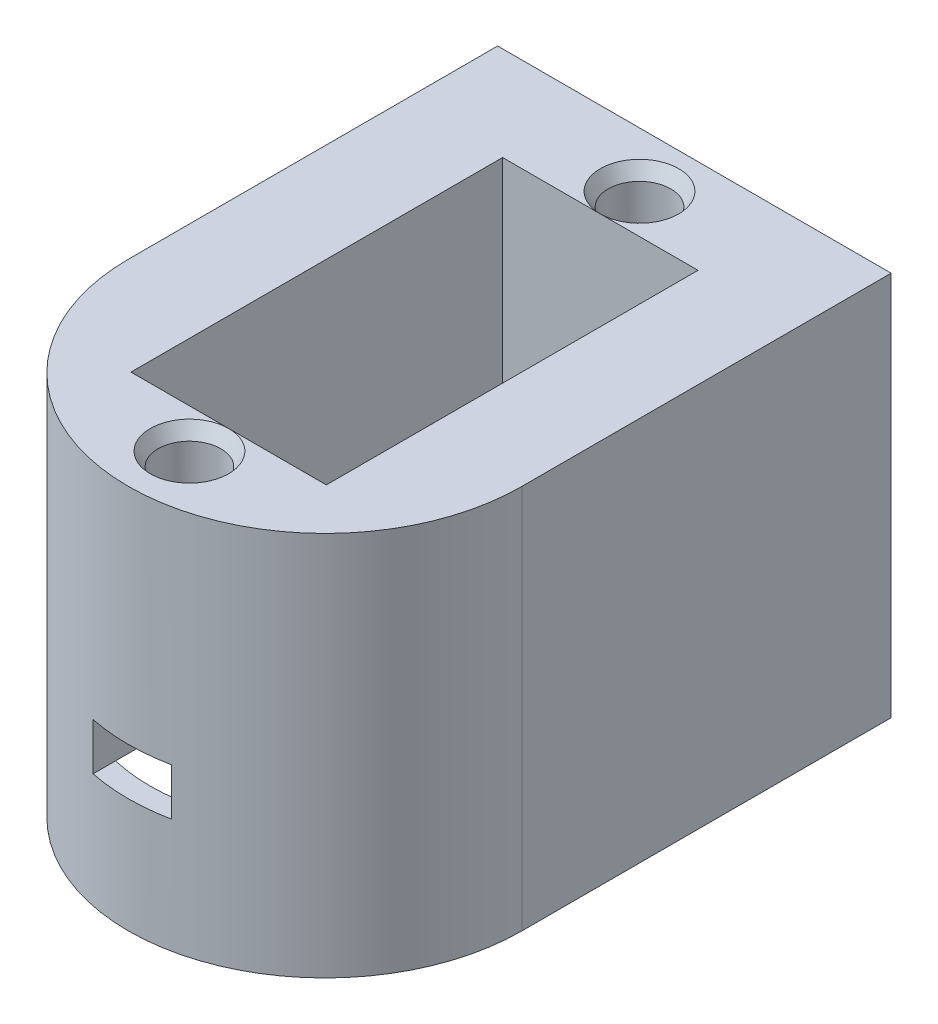
ISO-10303-21;
HEADER;
FILE_DESCRIPTION(('STEP AP214'),'2;1');
FILE_NAME('part.step','',(''),(''),'','','');
FILE_SCHEMA(('AUTOMOTIVE_DESIGN { 1 0 10303 214 1 1 1 1 }'));
ENDSEC;
DATA;
#1=APPLICATION_CONTEXT('core data for automotive mechanical design processes');
#2=APPLICATION_PROTOCOL_DEFINITION('international standard','automotive_design',2000,#1);
#3=PRODUCT_CONTEXT('',#1,'mechanical');
#4=PRODUCT('Part','Part','',(#3));
#5=PRODUCT_RELATED_PRODUCT_CATEGORY('part','',(#4));
#6=PRODUCT_DEFINITION_FORMATION('','',#4);
#7=PRODUCT_DEFINITION_CONTEXT('part definition',#1,'design');
#8=PRODUCT_DEFINITION('design','',#6,#7);
#9=PRODUCT_DEFINITION_SHAPE('','',#8);
#10=(LENGTH_UNIT() NAMED_UNIT(*) SI_UNIT(.MILLI.,.METRE.));
#11=(NAMED_UNIT(*) PLANE_ANGLE_UNIT() SI_UNIT($,.RADIAN.));
#12=(NAMED_UNIT(*) SI_UNIT($,.STERADIAN.) SOLID_ANGLE_UNIT());
#13=UNCERTAINTY_MEASURE_WITH_UNIT(LENGTH_MEASURE(1.E-05),#10,'distance_accuracy_value','');
#14=(GEOMETRIC_REPRESENTATION_CONTEXT(3) GLOBAL_UNCERTAINTY_ASSIGNED_CONTEXT((#13)) GLOBAL_UNIT_ASSIGNED_CONTEXT((#10,
#11,#12)) REPRESENTATION_CONTEXT('',''));
#15=CARTESIAN_POINT('',(0.,0.,0.));
#16=DIRECTION('',(0.,0.,1.));
#17=DIRECTION('',(1.,0.,0.));
#18=AXIS2_PLACEMENT_3D('',#15,#16,#17);
#19=CARTESIAN_POINT('',(-6.23,55.2500254806121,6.));
#20=DIRECTION('',(0.,1.,0.));
#21=DIRECTION('',(0.,0.,1.));
#22=AXIS2_PLACEMENT_3D('',#19,#20,#21);
#23=PLANE('',#22);
#24=DIRECTION('',(0.,0.,1.));
#25=VECTOR('',#24,1.);
#26=CARTESIAN_POINT('',(2.5,55.2500254806121,-0.001000000000001));
#27=LINE('',#26,#25);
#28=CARTESIAN_POINT('',(2.5,55.2500254806121,29.7));
#29=VERTEX_POINT('',#28);
#30=CARTESIAN_POINT('',(2.5,55.2500254806121,34.4161170617659));
#31=VERTEX_POINT('',#30);
#32=EDGE_CURVE('E319',#29,#31,#27,.T.);
#33=ORIENTED_EDGE('',*,*,#32,.F.);
#34=DIRECTION('',(1.,0.,0.));
#35=VECTOR('',#34,1.);
#36=CARTESIAN_POINT('',(-6.23,55.2500254806121,29.7));
#37=LINE('',#36,#35);
#38=CARTESIAN_POINT('',(6.23,55.2500254806121,29.7));
#39=VERTEX_POINT('',#38);
#40=EDGE_CURVE('E193',#29,#39,#37,.T.);
#41=ORIENTED_EDGE('',*,*,#40,.T.);
#42=DIRECTION('',(0.,0.,-1.));
#43=VECTOR('',#42,1.);
#44=CARTESIAN_POINT('',(6.23,55.2500254806121,29.7));
#45=LINE('',#44,#43);
#46=CARTESIAN_POINT('',(6.23,55.2500254806121,14.3028599015696));
#47=VERTEX_POINT('',#46);
#48=EDGE_CURVE('E194',#39,#47,#45,.T.);
#49=ORIENTED_EDGE('',*,*,#48,.T.);
#50=CARTESIAN_POINT('',(0.,55.2500254806121,23.55));
#51=DIRECTION('',(0.,1.,0.));
#52=DIRECTION('',(0.,0.,1.));
#53=AXIS2_PLACEMENT_3D('',#50,#51,#52);
#54=CIRCLE('',#53,11.15);
#55=EDGE_CURVE('E172',#31,#47,#54,.T.);
#56=ORIENTED_EDGE('',*,*,#55,.F.);
#57=EDGE_LOOP('',(#33,#41,#49,#56));
#58=FACE_BOUND('',#57,.T.);
#59=ADVANCED_FACE('F41',(#58),#23,.F.);
#60=CARTESIAN_POINT('',(-6.23,11.2879454134343,29.7));
#61=DIRECTION('',(0.,0.,-1.));
#62=DIRECTION('',(-1.,0.,0.));
#63=AXIS2_PLACEMENT_3D('',#60,#61,#62);
#64=PLANE('',#63);
#65=DIRECTION('',(-1.,0.,0.));
#66=VECTOR('',#65,1.);
#67=CARTESIAN_POINT('',(-2.5,58.2500254806121,29.7));
#68=LINE('',#67,#66);
#69=CARTESIAN_POINT('',(2.5,58.2500254806121,29.7));
#70=VERTEX_POINT('',#69);
#71=CARTESIAN_POINT('',(-2.5,58.2500254806121,29.7));
#72=VERTEX_POINT('',#71);
#73=EDGE_CURVE('E304',#70,#72,#68,.T.);
#74=ORIENTED_EDGE('',*,*,#73,.T.);
#75=DIRECTION('',(0.,-1.,0.));
#76=VECTOR('',#75,1.);
#77=CARTESIAN_POINT('',(-2.5,58.2500254806121,29.7));
#78=LINE('',#77,#76);
#79=CARTESIAN_POINT('',(-2.5,55.2500254806121,29.7));
#80=VERTEX_POINT('',#79);
#81=EDGE_CURVE('E303',#72,#80,#78,.T.);
#82=ORIENTED_EDGE('',*,*,#81,.T.);
#83=CARTESIAN_POINT('',(-6.23,55.2500254806121,29.7));
#84=VERTEX_POINT('',#83);
#85=EDGE_CURVE('E218',#84,#80,#37,.T.);
#86=ORIENTED_EDGE('',*,*,#85,.F.);
#87=DIRECTION('',(0.,1.,0.));
#88=VECTOR('',#87,1.);
#89=CARTESIAN_POINT('',(-6.23,11.2879454134343,29.7));
#90=LINE('',#89,#88);
#91=CARTESIAN_POINT('',(-6.23,72.5000254806121,29.7));
#92=VERTEX_POINT('',#91);
#93=EDGE_CURVE('E213',#84,#92,#90,.T.);
#94=ORIENTED_EDGE('',*,*,#93,.T.);
#95=DIRECTION('',(-1.,0.,0.));
#96=VECTOR('',#95,1.);
#97=CARTESIAN_POINT('',(-6.23,72.5000254806121,29.7));
#98=LINE('',#97,#96);
#99=CARTESIAN_POINT('',(0.,72.5000254806121,29.7));
#100=VERTEX_POINT('',#99);
#101=EDGE_CURVE('E200',#100,#92,#98,.T.);
#102=ORIENTED_EDGE('',*,*,#101,.F.);
#103=CARTESIAN_POINT('',(6.23,72.5000254806121,29.7));
#104=VERTEX_POINT('',#103);
#105=EDGE_CURVE('E199',#104,#100,#98,.T.);
#106=ORIENTED_EDGE('',*,*,#105,.F.);
#107=DIRECTION('',(0.,1.,0.));
#108=VECTOR('',#107,1.);
#109=CARTESIAN_POINT('',(6.23,11.2879454134343,29.7));
#110=LINE('',#109,#108);
#111=EDGE_CURVE('E209',#39,#104,#110,.T.);
#112=ORIENTED_EDGE('',*,*,#111,.F.);
#113=ORIENTED_EDGE('',*,*,#40,.F.);
#114=DIRECTION('',(0.,1.,0.));
#115=VECTOR('',#114,1.);
#116=CARTESIAN_POINT('',(2.5,58.2500254806121,29.7));
#117=LINE('',#116,#115);
#118=EDGE_CURVE('E307',#29,#70,#117,.T.);
#119=ORIENTED_EDGE('',*,*,#118,.T.);
#120=EDGE_LOOP('',(#74,#82,#86,#94,#102,#106,#112,#113,#119));
#121=FACE_BOUND('',#120,.T.);
#122=ADVANCED_FACE('F270',(#121),#64,.T.);
#123=CARTESIAN_POINT('',(-6.23,72.5000254806121,6.));
#124=DIRECTION('',(0.,-1.,0.));
#125=DIRECTION('',(0.,0.,-1.));
#126=AXIS2_PLACEMENT_3D('',#123,#124,#125);
#127=PLANE('',#126);
#128=DIRECTION('',(0.,0.,1.));
#129=VECTOR('',#128,1.);
#130=CARTESIAN_POINT('',(-12.5467811820916,72.5000254806121,23.55));
#131=LINE('',#130,#129);
#132=CARTESIAN_POINT('',(-12.5467811820916,72.5000254806121,0.));
#133=VERTEX_POINT('',#132);
#134=CARTESIAN_POINT('',(-12.5467811820916,72.5000254806121,23.55));
#135=VERTEX_POINT('',#134);
#136=EDGE_CURVE('E202',#133,#135,#131,.T.);
#137=ORIENTED_EDGE('',*,*,#136,.T.);
#138=CARTESIAN_POINT('',(0.,72.5000254806121,23.55));
#139=DIRECTION('',(0.,1.,0.));
#140=DIRECTION('',(0.,0.,1.));
#141=AXIS2_PLACEMENT_3D('',#138,#139,#140);
#142=CIRCLE('',#141,12.5467811820916);
#143=CARTESIAN_POINT('',(12.5467811820916,72.5000254806121,23.55));
#144=VERTEX_POINT('',#143);
#145=EDGE_CURVE('E207',#135,#144,#142,.T.);
#146=ORIENTED_EDGE('',*,*,#145,.T.);
#147=DIRECTION('',(0.,0.,-1.));
#148=VECTOR('',#147,1.);
#149=CARTESIAN_POINT('',(12.5467811820916,72.5000254806121,23.55));
#150=LINE('',#149,#148);
#151=CARTESIAN_POINT('',(12.5467811820916,72.5000254806121,0.));
#152=VERTEX_POINT('',#151);
#153=EDGE_CURVE('E160',#144,#152,#150,.T.);
#154=ORIENTED_EDGE('',*,*,#153,.T.);
#155=DIRECTION('',(-1.,0.,0.));
#156=VECTOR('',#155,1.);
#157=CARTESIAN_POINT('',(-6.23,72.5000254806121,0.));
#158=LINE('',#157,#156);
#159=EDGE_CURVE('E222',#152,#133,#158,.T.);
#160=ORIENTED_EDGE('',*,*,#159,.T.);
#161=EDGE_LOOP('',(#137,#146,#154,#160));
#162=FACE_BOUND('',#161,.T.);
#163=DIRECTION('',(0.,0.,-1.));
#164=VECTOR('',#163,1.);
#165=CARTESIAN_POINT('',(-6.23,72.5000254806121,0.));
#166=LINE('',#165,#164);
#167=CARTESIAN_POINT('',(-6.23,72.5000254806121,6.));
#168=VERTEX_POINT('',#167);
#169=EDGE_CURVE('E201',#92,#168,#166,.T.);
#170=ORIENTED_EDGE('',*,*,#169,.T.);
#171=DIRECTION('',(-1.,0.,0.));
#172=VECTOR('',#171,1.);
#173=CARTESIAN_POINT('',(-6.23,72.5000254806121,6.));
#174=LINE('',#173,#172);
#175=CARTESIAN_POINT('',(0.,72.5000254806121,6.));
#176=VERTEX_POINT('',#175);
#177=EDGE_CURVE('E231',#176,#168,#174,.T.);
#178=ORIENTED_EDGE('',*,*,#177,.F.);
#179=CARTESIAN_POINT('',(0.,72.5000254806121,3.5));
#180=DIRECTION('',(0.,-1.,0.));
#181=DIRECTION('',(0.,0.,-1.));
#182=AXIS2_PLACEMENT_3D('',#179,#180,#181);
#183=CIRCLE('',#182,2.49999999999999);
#184=EDGE_CURVE('E241',#176,#176,#183,.T.);
#185=ORIENTED_EDGE('',*,*,#184,.T.);
#186=CARTESIAN_POINT('',(6.23,72.5000254806121,6.));
#187=VERTEX_POINT('',#186);
#188=EDGE_CURVE('E234',#187,#176,#174,.T.);
#189=ORIENTED_EDGE('',*,*,#188,.F.);
#190=DIRECTION('',(0.,0.,1.));
#191=VECTOR('',#190,1.);
#192=CARTESIAN_POINT('',(6.23,72.5000254806121,29.7));
#193=LINE('',#192,#191);
#194=EDGE_CURVE('E190',#187,#104,#193,.T.);
#195=ORIENTED_EDGE('',*,*,#194,.T.);
#196=ORIENTED_EDGE('',*,*,#105,.T.);
#197=CARTESIAN_POINT('',(0.,72.5000254806121,32.2));
#198=DIRECTION('',(0.,-1.,0.));
#199=DIRECTION('',(0.,0.,-1.));
#200=AXIS2_PLACEMENT_3D('',#197,#198,#199);
#201=CIRCLE('',#200,2.5);
#202=EDGE_CURVE('E242',#100,#100,#201,.T.);
#203=ORIENTED_EDGE('',*,*,#202,.T.);
#204=ORIENTED_EDGE('',*,*,#101,.T.);
#205=EDGE_LOOP('',(#170,#178,#185,#189,#195,#196,#203,#204));
#206=FACE_BOUND('',#205,.T.);
#207=ADVANCED_FACE('F274',(#162,#206),#127,.F.);
#208=CARTESIAN_POINT('',(0.,11.2879454134343,23.55));
#209=DIRECTION('',(0.,1.,0.));
#210=DIRECTION('',(0.,0.,1.));
#211=AXIS2_PLACEMENT_3D('',#208,#209,#210);
#212=CYLINDRICAL_SURFACE('',#211,12.5467811820916);
#213=CARTESIAN_POINT('',(0.,47.9500254806121,23.55));
#214=DIRECTION('',(0.,-1.,0.));
#215=DIRECTION('',(0.,0.,-1.));
#216=AXIS2_PLACEMENT_3D('',#213,#214,#215);
#217=CIRCLE('',#216,12.5467811820916);
#218=CARTESIAN_POINT('',(12.5467811820916,47.9500254806121,23.55));
#219=VERTEX_POINT('',#218);
#220=CARTESIAN_POINT('',(-12.5467811820916,47.9500254806121,23.55));
#221=VERTEX_POINT('',#220);
#222=EDGE_CURVE('E170',#219,#221,#217,.T.);
#223=ORIENTED_EDGE('',*,*,#222,.F.);
#224=DIRECTION('',(0.,1.,0.));
#225=VECTOR('',#224,1.);
#226=CARTESIAN_POINT('',(12.5467811820916,11.2879454134343,23.55));
#227=LINE('',#226,#225);
#228=EDGE_CURVE('E152',#219,#144,#227,.T.);
#229=ORIENTED_EDGE('',*,*,#228,.T.);
#230=ORIENTED_EDGE('',*,*,#145,.F.);
#231=DIRECTION('',(0.,1.,0.));
#232=VECTOR('',#231,1.);
#233=CARTESIAN_POINT('',(-12.5467811820916,11.2879454134343,23.55));
#234=LINE('',#233,#232);
#235=EDGE_CURVE('E60',#221,#135,#234,.T.);
#236=ORIENTED_EDGE('',*,*,#235,.F.);
#237=EDGE_LOOP('',(#223,#229,#230,#236));
#238=FACE_BOUND('',#237,.T.);
#239=CARTESIAN_POINT('',(0.,55.2500254806121,23.55));
#240=DIRECTION('',(0.,-1.,0.));
#241=DIRECTION('',(0.,0.,-1.));
#242=AXIS2_PLACEMENT_3D('',#239,#240,#241);
#243=CIRCLE('',#242,12.5467811820916);
#244=CARTESIAN_POINT('',(2.5,55.2500254806121,35.8451908497302));
#245=VERTEX_POINT('',#244);
#246=CARTESIAN_POINT('',(-2.5,55.2500254806121,35.8451908497302));
#247=VERTEX_POINT('',#246);
#248=EDGE_CURVE('E387',#245,#247,#243,.T.);
#249=ORIENTED_EDGE('',*,*,#248,.T.);
#250=DIRECTION('',(0.,1.,0.));
#251=VECTOR('',#250,1.);
#252=CARTESIAN_POINT('',(-2.5,11.2879454134343,35.8451908497302));
#253=LINE('',#252,#251);
#254=CARTESIAN_POINT('',(-2.5,58.2500254806121,35.8451908497302));
#255=VERTEX_POINT('',#254);
#256=EDGE_CURVE('E386',#247,#255,#253,.T.);
#257=ORIENTED_EDGE('',*,*,#256,.T.);
#258=CARTESIAN_POINT('',(0.,58.2500254806121,23.55));
#259=DIRECTION('',(0.,1.,0.));
#260=DIRECTION('',(0.,0.,1.));
#261=AXIS2_PLACEMENT_3D('',#258,#259,#260);
#262=CIRCLE('',#261,12.5467811820916);
#263=CARTESIAN_POINT('',(2.5,58.2500254806121,35.8451908497302));
#264=VERTEX_POINT('',#263);
#265=EDGE_CURVE('E167',#255,#264,#262,.T.);
#266=ORIENTED_EDGE('',*,*,#265,.T.);
#267=DIRECTION('',(0.,1.,0.));
#268=VECTOR('',#267,1.);
#269=CARTESIAN_POINT('',(2.5,11.2879454134343,35.8451908497302));
#270=LINE('',#269,#268);
#271=EDGE_CURVE('E381',#264,#245,#270,.F.);
#272=ORIENTED_EDGE('',*,*,#271,.T.);
#273=EDGE_LOOP('',(#249,#257,#266,#272));
#274=FACE_BOUND('',#273,.T.);
#275=ADVANCED_FACE('F175',(#238,#274),#212,.T.);
#276=CARTESIAN_POINT('',(0.,107.987681704295,23.55));
#277=DIRECTION('',(0.,-1.,0.));
#278=DIRECTION('',(0.,0.,-1.));
#279=AXIS2_PLACEMENT_3D('',#276,#277,#278);
#280=CYLINDRICAL_SURFACE('',#279,11.15);
#281=CARTESIAN_POINT('',(0.,47.9500254806121,23.55));
#282=DIRECTION('',(0.,-1.,0.));
#283=DIRECTION('',(0.,0.,-1.));
#284=AXIS2_PLACEMENT_3D('',#281,#282,#283);
#285=CIRCLE('',#284,11.15);
#286=CARTESIAN_POINT('',(0.,47.9500254806121,12.4));
#287=VERTEX_POINT('',#286);
#288=EDGE_CURVE('E174',#287,#287,#285,.T.);
#289=ORIENTED_EDGE('',*,*,#288,.T.);
#290=EDGE_LOOP('',(#289));
#291=FACE_BOUND('',#290,.T.);
#292=CARTESIAN_POINT('',(0.,55.2500254806121,23.55));
#293=DIRECTION('',(0.,1.,0.));
#294=DIRECTION('',(0.,0.,1.));
#295=AXIS2_PLACEMENT_3D('',#292,#293,#294);
#296=CIRCLE('',#295,11.15);
#297=CARTESIAN_POINT('',(-6.23,55.2500254806121,14.3028599015696));
#298=VERTEX_POINT('',#297);
#299=EDGE_CURVE('E11',#298,#47,#296,.F.);
#300=ORIENTED_EDGE('',*,*,#299,.F.);
#301=CARTESIAN_POINT('',(-2.5,55.2500254806121,34.4161170617659));
#302=VERTEX_POINT('',#301);
#303=EDGE_CURVE('E179',#298,#302,#54,.T.);
#304=ORIENTED_EDGE('',*,*,#303,.T.);
#305=EDGE_CURVE('E178',#302,#31,#54,.T.);
#306=ORIENTED_EDGE('',*,*,#305,.T.);
#307=ORIENTED_EDGE('',*,*,#55,.T.);
#308=EDGE_LOOP('',(#300,#304,#306,#307));
#309=FACE_BOUND('',#308,.T.);
#310=ADVANCED_FACE('F282',(#291,#309),#280,.F.);
#311=ORIENTED_EDGE('',*,*,#85,.T.);
#312=DIRECTION('',(0.,0.,1.));
#313=VECTOR('',#312,1.);
#314=CARTESIAN_POINT('',(-2.5,55.2500254806121,-0.001000000000001));
#315=LINE('',#314,#313);
#316=EDGE_CURVE('E298',#80,#302,#315,.T.);
#317=ORIENTED_EDGE('',*,*,#316,.T.);
#318=ORIENTED_EDGE('',*,*,#303,.F.);
#319=DIRECTION('',(0.,0.,1.));
#320=VECTOR('',#319,1.);
#321=CARTESIAN_POINT('',(-6.23,55.2500254806121,0.));
#322=LINE('',#321,#320);
#323=EDGE_CURVE('E192',#298,#84,#322,.T.);
#324=ORIENTED_EDGE('',*,*,#323,.T.);
#325=EDGE_LOOP('',(#311,#317,#318,#324));
#326=FACE_BOUND('',#325,.T.);
#327=ADVANCED_FACE('F269',(#326),#23,.F.);
#328=CARTESIAN_POINT('',(0.,0.,6.));
#329=DIRECTION('',(0.,0.,-1.));
#330=DIRECTION('',(-1.,0.,0.));
#331=AXIS2_PLACEMENT_3D('',#328,#329,#330);
#332=PLANE('',#331);
#333=DIRECTION('',(0.,-1.,0.));
#334=VECTOR('',#333,1.);
#335=CARTESIAN_POINT('',(-6.23,55.2500254806121,6.));
#336=LINE('',#335,#334);
#337=CARTESIAN_POINT('',(-6.23,55.2500254806121,6.));
#338=VERTEX_POINT('',#337);
#339=EDGE_CURVE('E223',#168,#338,#336,.T.);
#340=ORIENTED_EDGE('',*,*,#339,.T.);
#341=DIRECTION('',(1.,0.,0.));
#342=VECTOR('',#341,1.);
#343=CARTESIAN_POINT('',(-6.23,55.2500254806121,6.));
#344=LINE('',#343,#342);
#345=CARTESIAN_POINT('',(6.23,55.2500254806121,6.));
#346=VERTEX_POINT('',#345);
#347=EDGE_CURVE('E227',#338,#346,#344,.T.);
#348=ORIENTED_EDGE('',*,*,#347,.T.);
#349=DIRECTION('',(0.,1.,0.));
#350=VECTOR('',#349,1.);
#351=CARTESIAN_POINT('',(6.23,55.2500254806121,6.));
#352=LINE('',#351,#350);
#353=EDGE_CURVE('E229',#346,#187,#352,.T.);
#354=ORIENTED_EDGE('',*,*,#353,.T.);
#355=ORIENTED_EDGE('',*,*,#188,.T.);
#356=ORIENTED_EDGE('',*,*,#177,.T.);
#357=EDGE_LOOP('',(#340,#348,#354,#355,#356));
#358=FACE_BOUND('',#357,.T.);
#359=ADVANCED_FACE('F278',(#358),#332,.F.);
#360=CARTESIAN_POINT('',(0.,0.,0.));
#361=DIRECTION('',(0.,0.,-1.));
#362=DIRECTION('',(-1.,0.,0.));
#363=AXIS2_PLACEMENT_3D('',#360,#361,#362);
#364=PLANE('',#363);
#365=DIRECTION('',(0.,1.,0.));
#366=VECTOR('',#365,1.);
#367=CARTESIAN_POINT('',(12.5467811820916,11.2879454134343,0.));
#368=LINE('',#367,#366);
#369=CARTESIAN_POINT('',(12.5467811820916,47.9500254806121,0.));
#370=VERTEX_POINT('',#369);
#371=EDGE_CURVE('E158',#370,#152,#368,.T.);
#372=ORIENTED_EDGE('',*,*,#371,.F.);
#373=DIRECTION('',(1.,0.,0.));
#374=VECTOR('',#373,1.);
#375=CARTESIAN_POINT('',(-12.5467811820916,47.9500254806121,0.));
#376=LINE('',#375,#374);
#377=CARTESIAN_POINT('',(-12.5467811820916,47.9500254806121,0.));
#378=VERTEX_POINT('',#377);
#379=EDGE_CURVE('E169',#378,#370,#376,.T.);
#380=ORIENTED_EDGE('',*,*,#379,.F.);
#381=DIRECTION('',(0.,1.,0.));
#382=VECTOR('',#381,1.);
#383=CARTESIAN_POINT('',(-12.5467811820916,11.2879454134343,0.));
#384=LINE('',#383,#382);
#385=EDGE_CURVE('E214',#378,#133,#384,.T.);
#386=ORIENTED_EDGE('',*,*,#385,.T.);
#387=ORIENTED_EDGE('',*,*,#159,.F.);
#388=EDGE_LOOP('',(#372,#380,#386,#387));
#389=FACE_BOUND('',#388,.T.);
#390=ADVANCED_FACE('F287',(#389),#364,.T.);
#391=CARTESIAN_POINT('',(-6.23,11.2879454134343,0.));
#392=DIRECTION('',(1.,0.,0.));
#393=DIRECTION('',(0.,0.,-1.));
#394=AXIS2_PLACEMENT_3D('',#391,#392,#393);
#395=PLANE('',#394);
#396=ORIENTED_EDGE('',*,*,#339,.F.);
#397=ORIENTED_EDGE('',*,*,#169,.F.);
#398=ORIENTED_EDGE('',*,*,#93,.F.);
#399=ORIENTED_EDGE('',*,*,#323,.F.);
#400=EDGE_CURVE('E189',#338,#298,#322,.T.);
#401=ORIENTED_EDGE('',*,*,#400,.F.);
#402=EDGE_LOOP('',(#396,#397,#398,#399,#401));
#403=FACE_BOUND('',#402,.T.);
#404=ADVANCED_FACE('F355',(#403),#395,.T.);
#405=CARTESIAN_POINT('',(6.23,11.2879454134343,29.7));
#406=DIRECTION('',(-1.,0.,0.));
#407=DIRECTION('',(0.,0.,1.));
#408=AXIS2_PLACEMENT_3D('',#405,#406,#407);
#409=PLANE('',#408);
#410=EDGE_CURVE('E188',#47,#346,#45,.T.);
#411=ORIENTED_EDGE('',*,*,#410,.F.);
#412=ORIENTED_EDGE('',*,*,#48,.F.);
#413=ORIENTED_EDGE('',*,*,#111,.T.);
#414=ORIENTED_EDGE('',*,*,#194,.F.);
#415=ORIENTED_EDGE('',*,*,#353,.F.);
#416=EDGE_LOOP('',(#411,#412,#413,#414,#415));
#417=FACE_BOUND('',#416,.T.);
#418=ADVANCED_FACE('F347',(#417),#409,.T.);
#419=CARTESIAN_POINT('',(12.5467811820916,11.2879454134343,23.55));
#420=DIRECTION('',(1.,0.,0.));
#421=DIRECTION('',(0.,0.,-1.));
#422=AXIS2_PLACEMENT_3D('',#419,#420,#421);
#423=PLANE('',#422);
#424=ORIENTED_EDGE('',*,*,#228,.F.);
#425=DIRECTION('',(0.,0.,1.));
#426=VECTOR('',#425,1.);
#427=CARTESIAN_POINT('',(12.5467811820916,47.9500254806121,0.));
#428=LINE('',#427,#426);
#429=EDGE_CURVE('E153',#370,#219,#428,.T.);
#430=ORIENTED_EDGE('',*,*,#429,.F.);
#431=ORIENTED_EDGE('',*,*,#371,.T.);
#432=ORIENTED_EDGE('',*,*,#153,.F.);
#433=EDGE_LOOP('',(#424,#430,#431,#432));
#434=FACE_BOUND('',#433,.T.);
#435=ADVANCED_FACE('F154',(#434),#423,.T.);
#436=CARTESIAN_POINT('',(-12.5467811820916,11.2879454134343,23.55));
#437=DIRECTION('',(-1.,0.,0.));
#438=DIRECTION('',(0.,0.,1.));
#439=AXIS2_PLACEMENT_3D('',#436,#437,#438);
#440=PLANE('',#439);
#441=ORIENTED_EDGE('',*,*,#385,.F.);
#442=DIRECTION('',(0.,0.,-1.));
#443=VECTOR('',#442,1.);
#444=CARTESIAN_POINT('',(-12.5467811820916,47.9500254806121,23.55));
#445=LINE('',#444,#443);
#446=EDGE_CURVE('E396',#221,#378,#445,.T.);
#447=ORIENTED_EDGE('',*,*,#446,.F.);
#448=ORIENTED_EDGE('',*,*,#235,.T.);
#449=ORIENTED_EDGE('',*,*,#136,.F.);
#450=EDGE_LOOP('',(#441,#447,#448,#449));
#451=FACE_BOUND('',#450,.T.);
#452=ADVANCED_FACE('F339',(#451),#440,.T.);
#453=CARTESIAN_POINT('',(0.,47.9500254806121,23.55));
#454=DIRECTION('',(0.,-1.,0.));
#455=DIRECTION('',(0.,0.,-1.));
#456=AXIS2_PLACEMENT_3D('',#453,#454,#455);
#457=PLANE('',#456);
#458=ORIENTED_EDGE('',*,*,#222,.T.);
#459=ORIENTED_EDGE('',*,*,#446,.T.);
#460=ORIENTED_EDGE('',*,*,#379,.T.);
#461=ORIENTED_EDGE('',*,*,#429,.T.);
#462=EDGE_LOOP('',(#458,#459,#460,#461));
#463=FACE_BOUND('',#462,.T.);
#464=ORIENTED_EDGE('',*,*,#288,.F.);
#465=EDGE_LOOP('',(#464));
#466=FACE_BOUND('',#465,.T.);
#467=ADVANCED_FACE('F165',(#463,#466),#457,.T.);
#468=CARTESIAN_POINT('',(0.,67.5000254806121,32.2));
#469=DIRECTION('',(0.,1.,0.));
#470=DIRECTION('',(0.,0.,1.));
#471=AXIS2_PLACEMENT_3D('',#468,#469,#470);
#472=CYLINDRICAL_SURFACE('',#471,2.);
#473=CARTESIAN_POINT('',(0.,71.6340000768277,32.2));
#474=DIRECTION('',(0.,-1.,0.));
#475=DIRECTION('',(0.,0.,-1.));
#476=AXIS2_PLACEMENT_3D('',#473,#474,#475);
#477=CIRCLE('',#476,2.);
#478=CARTESIAN_POINT('',(0.,71.6340000768277,30.2));
#479=VERTEX_POINT('',#478);
#480=EDGE_CURVE('E240',#479,#479,#477,.F.);
#481=ORIENTED_EDGE('',*,*,#480,.T.);
#482=EDGE_LOOP('',(#481));
#483=FACE_BOUND('',#482,.T.);
#484=CARTESIAN_POINT('',(0.,67.5000254806121,32.2));
#485=DIRECTION('',(0.,1.,0.));
#486=DIRECTION('',(0.,0.,1.));
#487=AXIS2_PLACEMENT_3D('',#484,#485,#486);
#488=CIRCLE('',#487,2.);
#489=CARTESIAN_POINT('',(0.,67.5000254806121,34.2));
#490=VERTEX_POINT('',#489);
#491=EDGE_CURVE('E313',#490,#490,#488,.T.);
#492=ORIENTED_EDGE('',*,*,#491,.F.);
#493=EDGE_LOOP('',(#492));
#494=FACE_BOUND('',#493,.T.);
#495=ADVANCED_FACE('F329',(#483,#494),#472,.F.);
#496=CARTESIAN_POINT('',(0.,67.5000254806121,32.2));
#497=DIRECTION('',(0.,1.,0.));
#498=DIRECTION('',(0.,0.,1.));
#499=AXIS2_PLACEMENT_3D('',#496,#497,#498);
#500=PLANE('',#499);
#501=ORIENTED_EDGE('',*,*,#491,.T.);
#502=EDGE_LOOP('',(#501));
#503=FACE_BOUND('',#502,.T.);
#504=ADVANCED_FACE('F327',(#503),#500,.T.);
#505=CARTESIAN_POINT('',(0.,67.5000254806121,3.5));
#506=DIRECTION('',(0.,1.,0.));
#507=DIRECTION('',(0.,0.,1.));
#508=AXIS2_PLACEMENT_3D('',#505,#506,#507);
#509=CYLINDRICAL_SURFACE('',#508,2.);
#510=CARTESIAN_POINT('',(0.,71.6340000768277,3.5));
#511=DIRECTION('',(0.,-1.,0.));
#512=DIRECTION('',(0.,0.,-1.));
#513=AXIS2_PLACEMENT_3D('',#510,#511,#512);
#514=CIRCLE('',#513,2.);
#515=CARTESIAN_POINT('',(0.,71.6340000768277,1.5));
#516=VERTEX_POINT('',#515);
#517=EDGE_CURVE('E49',#516,#516,#514,.F.);
#518=ORIENTED_EDGE('',*,*,#517,.T.);
#519=EDGE_LOOP('',(#518));
#520=FACE_BOUND('',#519,.T.);
#521=CARTESIAN_POINT('',(0.,67.5000254806121,3.5));
#522=DIRECTION('',(0.,1.,0.));
#523=DIRECTION('',(0.,0.,1.));
#524=AXIS2_PLACEMENT_3D('',#521,#522,#523);
#525=CIRCLE('',#524,2.);
#526=CARTESIAN_POINT('',(0.,67.5000254806121,5.5));
#527=VERTEX_POINT('',#526);
#528=EDGE_CURVE('E185',#527,#527,#525,.T.);
#529=ORIENTED_EDGE('',*,*,#528,.F.);
#530=EDGE_LOOP('',(#529));
#531=FACE_BOUND('',#530,.T.);
#532=ADVANCED_FACE('F248',(#520,#531),#509,.F.);
#533=CARTESIAN_POINT('',(0.,67.5000254806121,3.5));
#534=DIRECTION('',(0.,1.,0.));
#535=DIRECTION('',(0.,0.,1.));
#536=AXIS2_PLACEMENT_3D('',#533,#534,#535);
#537=PLANE('',#536);
#538=ORIENTED_EDGE('',*,*,#528,.T.);
#539=EDGE_LOOP('',(#538));
#540=FACE_BOUND('',#539,.T.);
#541=ADVANCED_FACE('F261',(#540),#537,.T.);
#542=CARTESIAN_POINT('',(0.,71.6340000768277,32.2));
#543=DIRECTION('',(0.,1.,0.));
#544=DIRECTION('',(0.,0.,1.));
#545=AXIS2_PLACEMENT_3D('',#542,#543,#544);
#546=CONICAL_SURFACE('',#545,2.,0.52359877559829);
#547=ORIENTED_EDGE('',*,*,#202,.F.);
#548=EDGE_LOOP('',(#547));
#549=FACE_BOUND('',#548,.T.);
#550=ORIENTED_EDGE('',*,*,#480,.F.);
#551=EDGE_LOOP('',(#550));
#552=FACE_BOUND('',#551,.T.);
#553=ADVANCED_FACE('F251',(#549,#552),#546,.F.);
#554=CARTESIAN_POINT('',(0.,71.6340000768277,3.5));
#555=DIRECTION('',(0.,1.,0.));
#556=DIRECTION('',(0.,0.,1.));
#557=AXIS2_PLACEMENT_3D('',#554,#555,#556);
#558=CONICAL_SURFACE('',#557,2.,0.523598775598293);
#559=ORIENTED_EDGE('',*,*,#184,.F.);
#560=EDGE_LOOP('',(#559));
#561=FACE_BOUND('',#560,.T.);
#562=ORIENTED_EDGE('',*,*,#517,.F.);
#563=EDGE_LOOP('',(#562));
#564=FACE_BOUND('',#563,.T.);
#565=ADVANCED_FACE('F42',(#561,#564),#558,.F.);
#566=CARTESIAN_POINT('',(-6.23,55.2500254806121,6.));
#567=DIRECTION('',(0.,1.,0.));
#568=DIRECTION('',(0.,0.,1.));
#569=AXIS2_PLACEMENT_3D('',#566,#567,#568);
#570=PLANE('',#569);
#571=ORIENTED_EDGE('',*,*,#400,.T.);
#572=ORIENTED_EDGE('',*,*,#299,.T.);
#573=ORIENTED_EDGE('',*,*,#410,.T.);
#574=ORIENTED_EDGE('',*,*,#347,.F.);
#575=EDGE_LOOP('',(#571,#572,#573,#574));
#576=FACE_BOUND('',#575,.T.);
#577=ADVANCED_FACE('F254',(#576),#570,.T.);
#578=CARTESIAN_POINT('',(-2.5,55.2500254806121,-0.001000000000001));
#579=DIRECTION('',(0.,-1.,0.));
#580=DIRECTION('',(0.,0.,-1.));
#581=AXIS2_PLACEMENT_3D('',#578,#579,#580);
#582=PLANE('',#581);
#583=EDGE_CURVE('E306',#302,#247,#315,.T.);
#584=ORIENTED_EDGE('',*,*,#583,.T.);
#585=ORIENTED_EDGE('',*,*,#248,.F.);
#586=EDGE_CURVE('E318',#31,#245,#27,.T.);
#587=ORIENTED_EDGE('',*,*,#586,.F.);
#588=ORIENTED_EDGE('',*,*,#305,.F.);
#589=EDGE_LOOP('',(#584,#585,#587,#588));
#590=FACE_BOUND('',#589,.T.);
#591=ADVANCED_FACE('F262',(#590),#582,.F.);
#592=CARTESIAN_POINT('',(2.5,58.2500254806121,-0.001000000000001));
#593=DIRECTION('',(1.,0.,0.));
#594=DIRECTION('',(0.,0.,-1.));
#595=AXIS2_PLACEMENT_3D('',#592,#593,#594);
#596=PLANE('',#595);
#597=DIRECTION('',(0.,0.,1.));
#598=VECTOR('',#597,1.);
#599=CARTESIAN_POINT('',(2.5,58.2500254806121,-0.001000000000001));
#600=LINE('',#599,#598);
#601=EDGE_CURVE('E314',#70,#264,#600,.T.);
#602=ORIENTED_EDGE('',*,*,#601,.F.);
#603=ORIENTED_EDGE('',*,*,#118,.F.);
#604=ORIENTED_EDGE('',*,*,#32,.T.);
#605=ORIENTED_EDGE('',*,*,#586,.T.);
#606=ORIENTED_EDGE('',*,*,#271,.F.);
#607=EDGE_LOOP('',(#602,#603,#604,#605,#606));
#608=FACE_BOUND('',#607,.T.);
#609=ADVANCED_FACE('F410',(#608),#596,.F.);
#610=CARTESIAN_POINT('',(-2.5,58.2500254806121,-0.001000000000001));
#611=DIRECTION('',(0.,1.,0.));
#612=DIRECTION('',(0.,0.,1.));
#613=AXIS2_PLACEMENT_3D('',#610,#611,#612);
#614=PLANE('',#613);
#615=ORIENTED_EDGE('',*,*,#265,.F.);
#616=DIRECTION('',(0.,0.,1.));
#617=VECTOR('',#616,1.);
#618=CARTESIAN_POINT('',(-2.5,58.2500254806121,-0.001000000000001));
#619=LINE('',#618,#617);
#620=EDGE_CURVE('E63',#72,#255,#619,.T.);
#621=ORIENTED_EDGE('',*,*,#620,.F.);
#622=ORIENTED_EDGE('',*,*,#73,.F.);
#623=ORIENTED_EDGE('',*,*,#601,.T.);
#624=EDGE_LOOP('',(#615,#621,#622,#623));
#625=FACE_BOUND('',#624,.T.);
#626=ADVANCED_FACE('F401',(#625),#614,.F.);
#627=CARTESIAN_POINT('',(-2.5,58.2500254806121,-0.001000000000001));
#628=DIRECTION('',(-1.,0.,0.));
#629=DIRECTION('',(0.,0.,1.));
#630=AXIS2_PLACEMENT_3D('',#627,#628,#629);
#631=PLANE('',#630);
#632=ORIENTED_EDGE('',*,*,#316,.F.);
#633=ORIENTED_EDGE('',*,*,#81,.F.);
#634=ORIENTED_EDGE('',*,*,#620,.T.);
#635=ORIENTED_EDGE('',*,*,#256,.F.);
#636=ORIENTED_EDGE('',*,*,#583,.F.);
#637=EDGE_LOOP('',(#632,#633,#634,#635,#636));
#638=FACE_BOUND('',#637,.T.);
#639=ADVANCED_FACE('F402',(#638),#631,.F.);
#640=CLOSED_SHELL('',(#59,#122,#207,#275,#310,#327,#359,#390,#404,#418,#435,#452,#467,#495,#504,
#532,#541,#553,#565,#577,#591,#609,#626,#639));
#641=MANIFOLD_SOLID_BREP('B2',#640);
#642=ADVANCED_BREP_SHAPE_REPRESENTATION('',(#18,#641),#14);
#643=SHAPE_DEFINITION_REPRESENTATION(#9,#642);
ENDSEC;
END-ISO-10303-21;
